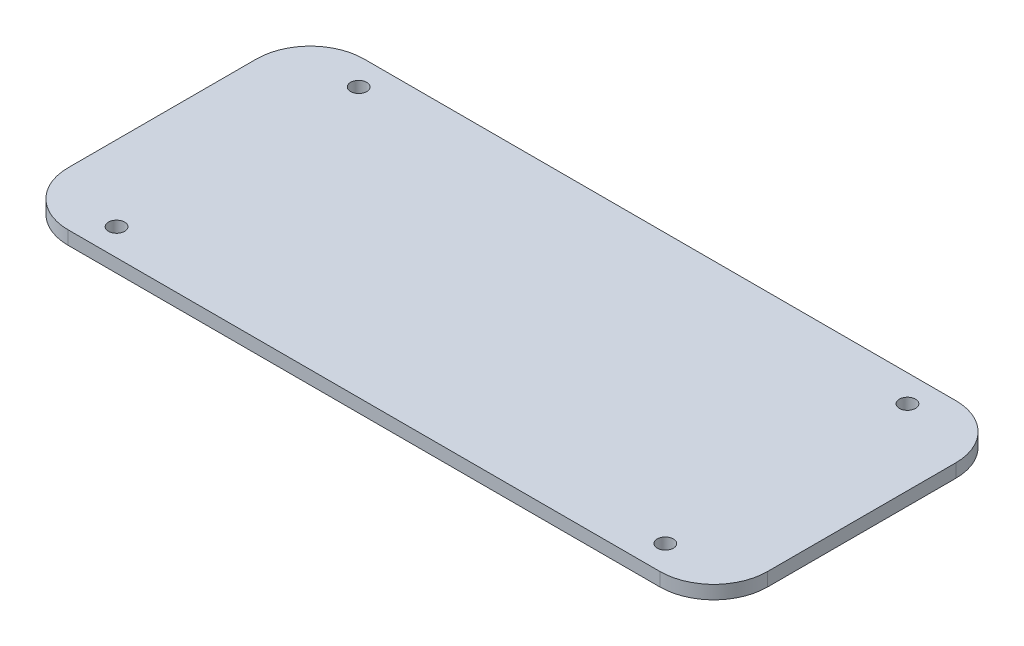
ISO-10303-21;
HEADER;
FILE_DESCRIPTION(('STEP AP214'),'2;1');
FILE_NAME('part.step','',(''),(''),'','','');
FILE_SCHEMA(('AUTOMOTIVE_DESIGN { 1 0 10303 214 1 1 1 1 }'));
ENDSEC;
DATA;
#1=APPLICATION_CONTEXT('core data for automotive mechanical design processes');
#2=APPLICATION_PROTOCOL_DEFINITION('international standard','automotive_design',2000,#1);
#3=PRODUCT_CONTEXT('',#1,'mechanical');
#4=PRODUCT('Part','Part','',(#3));
#5=PRODUCT_RELATED_PRODUCT_CATEGORY('part','',(#4));
#6=PRODUCT_DEFINITION_FORMATION('','',#4);
#7=PRODUCT_DEFINITION_CONTEXT('part definition',#1,'design');
#8=PRODUCT_DEFINITION('design','',#6,#7);
#9=PRODUCT_DEFINITION_SHAPE('','',#8);
#10=(LENGTH_UNIT() NAMED_UNIT(*) SI_UNIT(.MILLI.,.METRE.));
#11=(NAMED_UNIT(*) PLANE_ANGLE_UNIT() SI_UNIT($,.RADIAN.));
#12=(NAMED_UNIT(*) SI_UNIT($,.STERADIAN.) SOLID_ANGLE_UNIT());
#13=UNCERTAINTY_MEASURE_WITH_UNIT(LENGTH_MEASURE(1.E-05),#10,'distance_accuracy_value','');
#14=(GEOMETRIC_REPRESENTATION_CONTEXT(3) GLOBAL_UNCERTAINTY_ASSIGNED_CONTEXT((#13)) GLOBAL_UNIT_ASSIGNED_CONTEXT((#10,
#11,#12)) REPRESENTATION_CONTEXT('',''));
#15=CARTESIAN_POINT('',(0.,0.,0.));
#16=DIRECTION('',(0.,0.,1.));
#17=DIRECTION('',(1.,0.,0.));
#18=AXIS2_PLACEMENT_3D('',#15,#16,#17);
#19=CARTESIAN_POINT('',(10.,2.5,-45.));
#20=DIRECTION('',(0.,-1.,0.));
#21=DIRECTION('',(0.,0.,-1.));
#22=AXIS2_PLACEMENT_3D('',#19,#20,#21);
#23=CYLINDRICAL_SURFACE('',#22,10.);
#24=CARTESIAN_POINT('',(10.,0.,-45.));
#25=DIRECTION('',(0.,1.,0.));
#26=DIRECTION('',(0.,0.,1.));
#27=AXIS2_PLACEMENT_3D('',#24,#25,#26);
#28=CIRCLE('',#27,10.);
#29=CARTESIAN_POINT('',(10.0000000000001,0.,-55.));
#30=VERTEX_POINT('',#29);
#31=CARTESIAN_POINT('',(0.,0.,-44.9999999999999));
#32=VERTEX_POINT('',#31);
#33=EDGE_CURVE('E128',#30,#32,#28,.T.);
#34=ORIENTED_EDGE('',*,*,#33,.T.);
#35=DIRECTION('',(0.,-1.,0.));
#36=VECTOR('',#35,1.);
#37=CARTESIAN_POINT('',(0.,2.5,-44.9999999999999));
#38=LINE('',#37,#36);
#39=CARTESIAN_POINT('',(0.,2.5,-44.9999999999999));
#40=VERTEX_POINT('',#39);
#41=EDGE_CURVE('E11',#40,#32,#38,.T.);
#42=ORIENTED_EDGE('',*,*,#41,.F.);
#43=CARTESIAN_POINT('',(10.,2.5,-45.));
#44=DIRECTION('',(0.,1.,0.));
#45=DIRECTION('',(0.,0.,1.));
#46=AXIS2_PLACEMENT_3D('',#43,#44,#45);
#47=CIRCLE('',#46,10.);
#48=CARTESIAN_POINT('',(10.0000000000001,2.5,-55.));
#49=VERTEX_POINT('',#48);
#50=EDGE_CURVE('E143',#49,#40,#47,.T.);
#51=ORIENTED_EDGE('',*,*,#50,.F.);
#52=DIRECTION('',(0.,-1.,0.));
#53=VECTOR('',#52,1.);
#54=CARTESIAN_POINT('',(10.0000000000001,2.5,-55.));
#55=LINE('',#54,#53);
#56=EDGE_CURVE('E124',#49,#30,#55,.T.);
#57=ORIENTED_EDGE('',*,*,#56,.T.);
#58=EDGE_LOOP('',(#34,#42,#51,#57));
#59=FACE_BOUND('',#58,.T.);
#60=ADVANCED_FACE('F32',(#59),#23,.T.);
#61=CARTESIAN_POINT('',(0.,2.5,-10.0000000000001));
#62=DIRECTION('',(1.,0.,0.));
#63=DIRECTION('',(0.,0.,-1.));
#64=AXIS2_PLACEMENT_3D('',#61,#62,#63);
#65=PLANE('',#64);
#66=DIRECTION('',(0.,0.,1.));
#67=VECTOR('',#66,1.);
#68=CARTESIAN_POINT('',(0.,0.,-10.0000000000001));
#69=LINE('',#68,#67);
#70=CARTESIAN_POINT('',(0.,0.,-10.0000000000001));
#71=VERTEX_POINT('',#70);
#72=EDGE_CURVE('E131',#32,#71,#69,.T.);
#73=ORIENTED_EDGE('',*,*,#72,.T.);
#74=DIRECTION('',(0.,-1.,0.));
#75=VECTOR('',#74,1.);
#76=CARTESIAN_POINT('',(0.,2.5,-10.0000000000001));
#77=LINE('',#76,#75);
#78=CARTESIAN_POINT('',(0.,2.5,-10.0000000000001));
#79=VERTEX_POINT('',#78);
#80=EDGE_CURVE('E40',#79,#71,#77,.T.);
#81=ORIENTED_EDGE('',*,*,#80,.F.);
#82=DIRECTION('',(0.,0.,1.));
#83=VECTOR('',#82,1.);
#84=CARTESIAN_POINT('',(0.,2.5,-10.0000000000001));
#85=LINE('',#84,#83);
#86=EDGE_CURVE('E91',#40,#79,#85,.T.);
#87=ORIENTED_EDGE('',*,*,#86,.F.);
#88=ORIENTED_EDGE('',*,*,#41,.T.);
#89=EDGE_LOOP('',(#73,#81,#87,#88));
#90=FACE_BOUND('',#89,.T.);
#91=ADVANCED_FACE('F233',(#90),#65,.F.);
#92=CARTESIAN_POINT('',(10.,2.5,-10.));
#93=DIRECTION('',(0.,-1.,0.));
#94=DIRECTION('',(0.,0.,-1.));
#95=AXIS2_PLACEMENT_3D('',#92,#93,#94);
#96=CYLINDRICAL_SURFACE('',#95,10.);
#97=CARTESIAN_POINT('',(10.,0.,-10.));
#98=DIRECTION('',(0.,1.,0.));
#99=DIRECTION('',(0.,0.,1.));
#100=AXIS2_PLACEMENT_3D('',#97,#98,#99);
#101=CIRCLE('',#100,10.);
#102=CARTESIAN_POINT('',(10.0000000000001,0.,0.));
#103=VERTEX_POINT('',#102);
#104=EDGE_CURVE('E134',#71,#103,#101,.T.);
#105=ORIENTED_EDGE('',*,*,#104,.T.);
#106=DIRECTION('',(0.,-1.,0.));
#107=VECTOR('',#106,1.);
#108=CARTESIAN_POINT('',(10.0000000000001,2.5,0.));
#109=LINE('',#108,#107);
#110=CARTESIAN_POINT('',(10.0000000000001,2.5,0.));
#111=VERTEX_POINT('',#110);
#112=EDGE_CURVE('E150',#111,#103,#109,.T.);
#113=ORIENTED_EDGE('',*,*,#112,.F.);
#114=CARTESIAN_POINT('',(10.,2.5,-10.));
#115=DIRECTION('',(0.,1.,0.));
#116=DIRECTION('',(0.,0.,1.));
#117=AXIS2_PLACEMENT_3D('',#114,#115,#116);
#118=CIRCLE('',#117,10.);
#119=EDGE_CURVE('E158',#79,#111,#118,.T.);
#120=ORIENTED_EDGE('',*,*,#119,.F.);
#121=ORIENTED_EDGE('',*,*,#80,.T.);
#122=EDGE_LOOP('',(#105,#113,#120,#121));
#123=FACE_BOUND('',#122,.T.);
#124=ADVANCED_FACE('F156',(#123),#96,.T.);
#125=CARTESIAN_POINT('',(10.0000000000001,2.5,0.));
#126=DIRECTION('',(0.,0.,-1.));
#127=DIRECTION('',(-1.,0.,0.));
#128=AXIS2_PLACEMENT_3D('',#125,#126,#127);
#129=PLANE('',#128);
#130=DIRECTION('',(1.,0.,0.));
#131=VECTOR('',#130,1.);
#132=CARTESIAN_POINT('',(10.0000000000001,0.,0.));
#133=LINE('',#132,#131);
#134=CARTESIAN_POINT('',(120.,0.,0.));
#135=VERTEX_POINT('',#134);
#136=EDGE_CURVE('E136',#103,#135,#133,.T.);
#137=ORIENTED_EDGE('',*,*,#136,.T.);
#138=DIRECTION('',(0.,-1.,0.));
#139=VECTOR('',#138,1.);
#140=CARTESIAN_POINT('',(120.,2.5,0.));
#141=LINE('',#140,#139);
#142=CARTESIAN_POINT('',(120.,2.5,0.));
#143=VERTEX_POINT('',#142);
#144=EDGE_CURVE('E147',#143,#135,#141,.T.);
#145=ORIENTED_EDGE('',*,*,#144,.F.);
#146=DIRECTION('',(1.,0.,0.));
#147=VECTOR('',#146,1.);
#148=CARTESIAN_POINT('',(10.0000000000001,2.5,0.));
#149=LINE('',#148,#147);
#150=EDGE_CURVE('E170',#111,#143,#149,.T.);
#151=ORIENTED_EDGE('',*,*,#150,.F.);
#152=ORIENTED_EDGE('',*,*,#112,.T.);
#153=EDGE_LOOP('',(#137,#145,#151,#152));
#154=FACE_BOUND('',#153,.T.);
#155=ADVANCED_FACE('F166',(#154),#129,.F.);
#156=CARTESIAN_POINT('',(120.,2.5,-10.));
#157=DIRECTION('',(0.,-1.,0.));
#158=DIRECTION('',(0.,0.,-1.));
#159=AXIS2_PLACEMENT_3D('',#156,#157,#158);
#160=CYLINDRICAL_SURFACE('',#159,10.);
#161=CARTESIAN_POINT('',(120.,0.,-10.));
#162=DIRECTION('',(0.,1.,0.));
#163=DIRECTION('',(0.,0.,-1.));
#164=AXIS2_PLACEMENT_3D('',#161,#162,#163);
#165=CIRCLE('',#164,10.);
#166=CARTESIAN_POINT('',(130.,0.,-10.0000000000001));
#167=VERTEX_POINT('',#166);
#168=EDGE_CURVE('E138',#135,#167,#165,.T.);
#169=ORIENTED_EDGE('',*,*,#168,.T.);
#170=DIRECTION('',(0.,-1.,0.));
#171=VECTOR('',#170,1.);
#172=CARTESIAN_POINT('',(130.,2.5,-10.0000000000001));
#173=LINE('',#172,#171);
#174=CARTESIAN_POINT('',(130.,2.5,-10.0000000000001));
#175=VERTEX_POINT('',#174);
#176=EDGE_CURVE('E119',#175,#167,#173,.T.);
#177=ORIENTED_EDGE('',*,*,#176,.F.);
#178=CARTESIAN_POINT('',(120.,2.5,-10.));
#179=DIRECTION('',(0.,1.,0.));
#180=DIRECTION('',(0.,0.,-1.));
#181=AXIS2_PLACEMENT_3D('',#178,#179,#180);
#182=CIRCLE('',#181,10.);
#183=EDGE_CURVE('E110',#143,#175,#182,.T.);
#184=ORIENTED_EDGE('',*,*,#183,.F.);
#185=ORIENTED_EDGE('',*,*,#144,.T.);
#186=EDGE_LOOP('',(#169,#177,#184,#185));
#187=FACE_BOUND('',#186,.T.);
#188=ADVANCED_FACE('F169',(#187),#160,.T.);
#189=CARTESIAN_POINT('',(130.,2.5,-10.0000000000001));
#190=DIRECTION('',(-1.,0.,0.));
#191=DIRECTION('',(0.,0.,1.));
#192=AXIS2_PLACEMENT_3D('',#189,#190,#191);
#193=PLANE('',#192);
#194=DIRECTION('',(0.,0.,-1.));
#195=VECTOR('',#194,1.);
#196=CARTESIAN_POINT('',(130.,0.,-10.0000000000001));
#197=LINE('',#196,#195);
#198=CARTESIAN_POINT('',(130.,0.,-44.9999999999999));
#199=VERTEX_POINT('',#198);
#200=EDGE_CURVE('E118',#167,#199,#197,.T.);
#201=ORIENTED_EDGE('',*,*,#200,.T.);
#202=DIRECTION('',(0.,-1.,0.));
#203=VECTOR('',#202,1.);
#204=CARTESIAN_POINT('',(130.,2.5,-44.9999999999999));
#205=LINE('',#204,#203);
#206=CARTESIAN_POINT('',(130.,2.5,-44.9999999999999));
#207=VERTEX_POINT('',#206);
#208=EDGE_CURVE('E115',#207,#199,#205,.T.);
#209=ORIENTED_EDGE('',*,*,#208,.F.);
#210=DIRECTION('',(0.,0.,-1.));
#211=VECTOR('',#210,1.);
#212=CARTESIAN_POINT('',(130.,2.5,-10.0000000000001));
#213=LINE('',#212,#211);
#214=EDGE_CURVE('E104',#175,#207,#213,.T.);
#215=ORIENTED_EDGE('',*,*,#214,.F.);
#216=ORIENTED_EDGE('',*,*,#176,.T.);
#217=EDGE_LOOP('',(#201,#209,#215,#216));
#218=FACE_BOUND('',#217,.T.);
#219=ADVANCED_FACE('F116',(#218),#193,.F.);
#220=CARTESIAN_POINT('',(120.,2.5,-45.));
#221=DIRECTION('',(0.,-1.,0.));
#222=DIRECTION('',(0.,0.,-1.));
#223=AXIS2_PLACEMENT_3D('',#220,#221,#222);
#224=CYLINDRICAL_SURFACE('',#223,10.);
#225=CARTESIAN_POINT('',(120.,0.,-45.));
#226=DIRECTION('',(0.,1.,0.));
#227=DIRECTION('',(0.,0.,-1.));
#228=AXIS2_PLACEMENT_3D('',#225,#226,#227);
#229=CIRCLE('',#228,10.);
#230=CARTESIAN_POINT('',(120.,0.,-55.));
#231=VERTEX_POINT('',#230);
#232=EDGE_CURVE('E77',#199,#231,#229,.T.);
#233=ORIENTED_EDGE('',*,*,#232,.T.);
#234=DIRECTION('',(0.,-1.,0.));
#235=VECTOR('',#234,1.);
#236=CARTESIAN_POINT('',(120.,2.5,-55.));
#237=LINE('',#236,#235);
#238=CARTESIAN_POINT('',(120.,2.5,-55.));
#239=VERTEX_POINT('',#238);
#240=EDGE_CURVE('E120',#239,#231,#237,.T.);
#241=ORIENTED_EDGE('',*,*,#240,.F.);
#242=CARTESIAN_POINT('',(120.,2.5,-45.));
#243=DIRECTION('',(0.,1.,0.));
#244=DIRECTION('',(0.,0.,-1.));
#245=AXIS2_PLACEMENT_3D('',#242,#243,#244);
#246=CIRCLE('',#245,10.);
#247=EDGE_CURVE('E108',#207,#239,#246,.T.);
#248=ORIENTED_EDGE('',*,*,#247,.F.);
#249=ORIENTED_EDGE('',*,*,#208,.T.);
#250=EDGE_LOOP('',(#233,#241,#248,#249));
#251=FACE_BOUND('',#250,.T.);
#252=ADVANCED_FACE('F122',(#251),#224,.T.);
#253=CARTESIAN_POINT('',(10.0000000000001,2.5,-55.));
#254=DIRECTION('',(0.,0.,1.));
#255=DIRECTION('',(1.,0.,0.));
#256=AXIS2_PLACEMENT_3D('',#253,#254,#255);
#257=PLANE('',#256);
#258=DIRECTION('',(-1.,0.,0.));
#259=VECTOR('',#258,1.);
#260=CARTESIAN_POINT('',(10.0000000000001,0.,-55.));
#261=LINE('',#260,#259);
#262=EDGE_CURVE('E83',#231,#30,#261,.T.);
#263=ORIENTED_EDGE('',*,*,#262,.T.);
#264=ORIENTED_EDGE('',*,*,#56,.F.);
#265=DIRECTION('',(-1.,0.,0.));
#266=VECTOR('',#265,1.);
#267=CARTESIAN_POINT('',(10.0000000000001,2.5,-55.));
#268=LINE('',#267,#266);
#269=EDGE_CURVE('E48',#239,#49,#268,.T.);
#270=ORIENTED_EDGE('',*,*,#269,.F.);
#271=ORIENTED_EDGE('',*,*,#240,.T.);
#272=EDGE_LOOP('',(#263,#264,#270,#271));
#273=FACE_BOUND('',#272,.T.);
#274=ADVANCED_FACE('F211',(#273),#257,.F.);
#275=CARTESIAN_POINT('',(10.,2.5,-45.));
#276=DIRECTION('',(0.,1.,0.));
#277=DIRECTION('',(0.,0.,1.));
#278=AXIS2_PLACEMENT_3D('',#275,#276,#277);
#279=PLANE('',#278);
#280=CARTESIAN_POINT('',(116.,2.5,-50.));
#281=DIRECTION('',(0.,1.,0.));
#282=DIRECTION('',(0.,0.,-1.));
#283=AXIS2_PLACEMENT_3D('',#280,#281,#282);
#284=CIRCLE('',#283,1.5);
#285=CARTESIAN_POINT('',(116.,2.5,-51.5));
#286=VERTEX_POINT('',#285);
#287=EDGE_CURVE('E194',#286,#286,#284,.T.);
#288=ORIENTED_EDGE('',*,*,#287,.F.);
#289=EDGE_LOOP('',(#288));
#290=FACE_BOUND('',#289,.T.);
#291=CARTESIAN_POINT('',(116.,2.5,-4.99999999999997));
#292=DIRECTION('',(0.,1.,0.));
#293=DIRECTION('',(0.,0.,-1.));
#294=AXIS2_PLACEMENT_3D('',#291,#292,#293);
#295=CIRCLE('',#294,1.5);
#296=CARTESIAN_POINT('',(116.,2.5,-6.49999999999997));
#297=VERTEX_POINT('',#296);
#298=EDGE_CURVE('E188',#297,#297,#295,.T.);
#299=ORIENTED_EDGE('',*,*,#298,.F.);
#300=EDGE_LOOP('',(#299));
#301=FACE_BOUND('',#300,.T.);
#302=CARTESIAN_POINT('',(14.,2.5,-50.));
#303=DIRECTION('',(0.,1.,0.));
#304=DIRECTION('',(0.,0.,1.));
#305=AXIS2_PLACEMENT_3D('',#302,#303,#304);
#306=CIRCLE('',#305,1.5);
#307=CARTESIAN_POINT('',(14.,2.5,-48.5));
#308=VERTEX_POINT('',#307);
#309=EDGE_CURVE('E182',#308,#308,#306,.T.);
#310=ORIENTED_EDGE('',*,*,#309,.F.);
#311=EDGE_LOOP('',(#310));
#312=FACE_BOUND('',#311,.T.);
#313=CARTESIAN_POINT('',(14.,2.5,-5.));
#314=DIRECTION('',(0.,1.,0.));
#315=DIRECTION('',(0.,0.,1.));
#316=AXIS2_PLACEMENT_3D('',#313,#314,#315);
#317=CIRCLE('',#316,1.5);
#318=CARTESIAN_POINT('',(14.,2.5,-3.5));
#319=VERTEX_POINT('',#318);
#320=EDGE_CURVE('E176',#319,#319,#317,.T.);
#321=ORIENTED_EDGE('',*,*,#320,.F.);
#322=EDGE_LOOP('',(#321));
#323=FACE_BOUND('',#322,.T.);
#324=ORIENTED_EDGE('',*,*,#50,.T.);
#325=ORIENTED_EDGE('',*,*,#86,.T.);
#326=ORIENTED_EDGE('',*,*,#119,.T.);
#327=ORIENTED_EDGE('',*,*,#150,.T.);
#328=ORIENTED_EDGE('',*,*,#183,.T.);
#329=ORIENTED_EDGE('',*,*,#214,.T.);
#330=ORIENTED_EDGE('',*,*,#247,.T.);
#331=ORIENTED_EDGE('',*,*,#269,.T.);
#332=EDGE_LOOP('',(#324,#325,#326,#327,#328,#329,#330,#331));
#333=FACE_BOUND('',#332,.T.);
#334=ADVANCED_FACE('F106',(#290,#301,#312,#323,#333),#279,.T.);
#335=CARTESIAN_POINT('',(10.,0.,-45.));
#336=DIRECTION('',(0.,1.,0.));
#337=DIRECTION('',(0.,0.,1.));
#338=AXIS2_PLACEMENT_3D('',#335,#336,#337);
#339=PLANE('',#338);
#340=CARTESIAN_POINT('',(116.,0.,-50.));
#341=DIRECTION('',(0.,1.,0.));
#342=DIRECTION('',(0.,0.,-1.));
#343=AXIS2_PLACEMENT_3D('',#340,#341,#342);
#344=CIRCLE('',#343,1.5);
#345=CARTESIAN_POINT('',(116.,0.,-51.5));
#346=VERTEX_POINT('',#345);
#347=EDGE_CURVE('E191',#346,#346,#344,.T.);
#348=ORIENTED_EDGE('',*,*,#347,.T.);
#349=EDGE_LOOP('',(#348));
#350=FACE_BOUND('',#349,.T.);
#351=CARTESIAN_POINT('',(116.,0.,-4.99999999999997));
#352=DIRECTION('',(0.,1.,0.));
#353=DIRECTION('',(0.,0.,-1.));
#354=AXIS2_PLACEMENT_3D('',#351,#352,#353);
#355=CIRCLE('',#354,1.5);
#356=CARTESIAN_POINT('',(116.,0.,-6.49999999999997));
#357=VERTEX_POINT('',#356);
#358=EDGE_CURVE('E185',#357,#357,#355,.T.);
#359=ORIENTED_EDGE('',*,*,#358,.T.);
#360=EDGE_LOOP('',(#359));
#361=FACE_BOUND('',#360,.T.);
#362=CARTESIAN_POINT('',(14.,0.,-50.));
#363=DIRECTION('',(0.,1.,0.));
#364=DIRECTION('',(0.,0.,1.));
#365=AXIS2_PLACEMENT_3D('',#362,#363,#364);
#366=CIRCLE('',#365,1.5);
#367=CARTESIAN_POINT('',(14.,0.,-48.5));
#368=VERTEX_POINT('',#367);
#369=EDGE_CURVE('E179',#368,#368,#366,.T.);
#370=ORIENTED_EDGE('',*,*,#369,.T.);
#371=EDGE_LOOP('',(#370));
#372=FACE_BOUND('',#371,.T.);
#373=CARTESIAN_POINT('',(14.,0.,-5.));
#374=DIRECTION('',(0.,1.,0.));
#375=DIRECTION('',(0.,0.,1.));
#376=AXIS2_PLACEMENT_3D('',#373,#374,#375);
#377=CIRCLE('',#376,1.5);
#378=CARTESIAN_POINT('',(14.,0.,-3.5));
#379=VERTEX_POINT('',#378);
#380=EDGE_CURVE('E132',#379,#379,#377,.T.);
#381=ORIENTED_EDGE('',*,*,#380,.T.);
#382=EDGE_LOOP('',(#381));
#383=FACE_BOUND('',#382,.T.);
#384=ORIENTED_EDGE('',*,*,#33,.F.);
#385=ORIENTED_EDGE('',*,*,#262,.F.);
#386=ORIENTED_EDGE('',*,*,#232,.F.);
#387=ORIENTED_EDGE('',*,*,#200,.F.);
#388=ORIENTED_EDGE('',*,*,#168,.F.);
#389=ORIENTED_EDGE('',*,*,#136,.F.);
#390=ORIENTED_EDGE('',*,*,#104,.F.);
#391=ORIENTED_EDGE('',*,*,#72,.F.);
#392=EDGE_LOOP('',(#384,#385,#386,#387,#388,#389,#390,#391));
#393=FACE_BOUND('',#392,.T.);
#394=ADVANCED_FACE('F162',(#350,#361,#372,#383,#393),#339,.F.);
#395=CARTESIAN_POINT('',(14.,0.,-5.));
#396=DIRECTION('',(0.,1.,0.));
#397=DIRECTION('',(0.,0.,1.));
#398=AXIS2_PLACEMENT_3D('',#395,#396,#397);
#399=CYLINDRICAL_SURFACE('',#398,1.5);
#400=ORIENTED_EDGE('',*,*,#380,.F.);
#401=EDGE_LOOP('',(#400));
#402=FACE_BOUND('',#401,.T.);
#403=ORIENTED_EDGE('',*,*,#320,.T.);
#404=EDGE_LOOP('',(#403));
#405=FACE_BOUND('',#404,.T.);
#406=ADVANCED_FACE('F219',(#402,#405),#399,.F.);
#407=CARTESIAN_POINT('',(14.,0.,-50.));
#408=DIRECTION('',(0.,1.,0.));
#409=DIRECTION('',(0.,0.,1.));
#410=AXIS2_PLACEMENT_3D('',#407,#408,#409);
#411=CYLINDRICAL_SURFACE('',#410,1.5);
#412=ORIENTED_EDGE('',*,*,#369,.F.);
#413=EDGE_LOOP('',(#412));
#414=FACE_BOUND('',#413,.T.);
#415=ORIENTED_EDGE('',*,*,#309,.T.);
#416=EDGE_LOOP('',(#415));
#417=FACE_BOUND('',#416,.T.);
#418=ADVANCED_FACE('F221',(#414,#417),#411,.F.);
#419=CARTESIAN_POINT('',(116.,0.,-4.99999999999997));
#420=DIRECTION('',(0.,1.,0.));
#421=DIRECTION('',(0.,0.,1.));
#422=AXIS2_PLACEMENT_3D('',#419,#420,#421);
#423=CYLINDRICAL_SURFACE('',#422,1.5);
#424=ORIENTED_EDGE('',*,*,#358,.F.);
#425=EDGE_LOOP('',(#424));
#426=FACE_BOUND('',#425,.T.);
#427=ORIENTED_EDGE('',*,*,#298,.T.);
#428=EDGE_LOOP('',(#427));
#429=FACE_BOUND('',#428,.T.);
#430=ADVANCED_FACE('F205',(#426,#429),#423,.F.);
#431=CARTESIAN_POINT('',(116.,0.,-50.));
#432=DIRECTION('',(0.,1.,0.));
#433=DIRECTION('',(0.,0.,1.));
#434=AXIS2_PLACEMENT_3D('',#431,#432,#433);
#435=CYLINDRICAL_SURFACE('',#434,1.5);
#436=ORIENTED_EDGE('',*,*,#347,.F.);
#437=EDGE_LOOP('',(#436));
#438=FACE_BOUND('',#437,.T.);
#439=ORIENTED_EDGE('',*,*,#287,.T.);
#440=EDGE_LOOP('',(#439));
#441=FACE_BOUND('',#440,.T.);
#442=ADVANCED_FACE('F202',(#438,#441),#435,.F.);
#443=CLOSED_SHELL('',(#60,#91,#124,#155,#188,#219,#252,#274,#334,#394,#406,#418,#430,#442));
#444=MANIFOLD_SOLID_BREP('B2',#443);
#445=ADVANCED_BREP_SHAPE_REPRESENTATION('',(#18,#444),#14);
#446=SHAPE_DEFINITION_REPRESENTATION(#9,#445);
ENDSEC;
END-ISO-10303-21;
